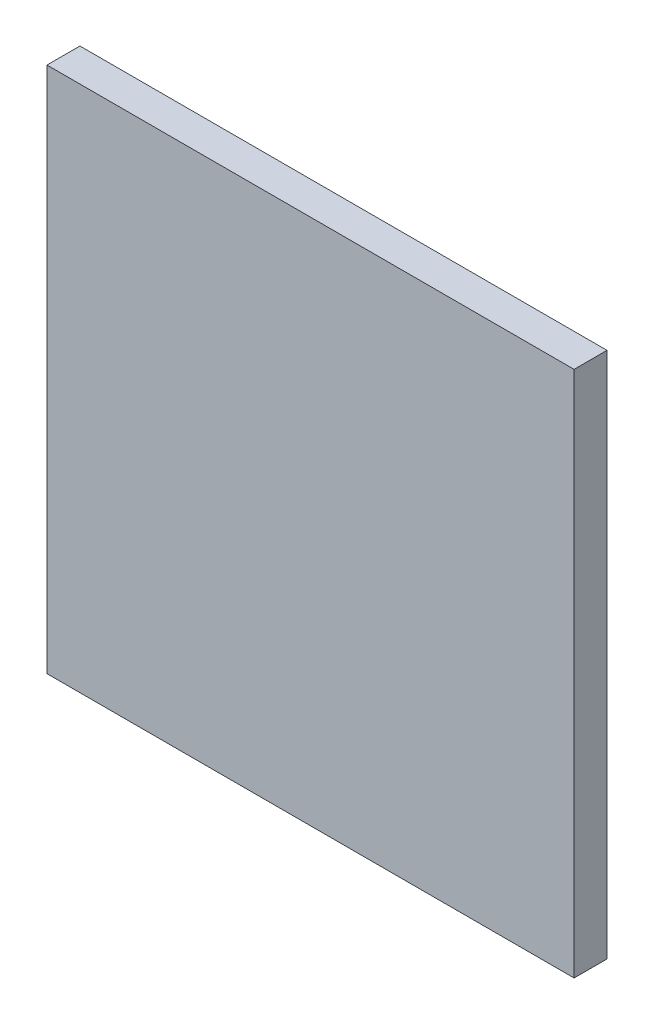
ISO-10303-21;
HEADER;
FILE_DESCRIPTION(('STEP AP214'),'2;1');
FILE_NAME('part.step','',(''),(''),'','','');
FILE_SCHEMA(('AUTOMOTIVE_DESIGN { 1 0 10303 214 1 1 1 1 }'));
ENDSEC;
DATA;
#1=APPLICATION_CONTEXT('core data for automotive mechanical design processes');
#2=APPLICATION_PROTOCOL_DEFINITION('international standard','automotive_design',2000,#1);
#3=PRODUCT_CONTEXT('',#1,'mechanical');
#4=PRODUCT('Part','Part','',(#3));
#5=PRODUCT_RELATED_PRODUCT_CATEGORY('part','',(#4));
#6=PRODUCT_DEFINITION_FORMATION('','',#4);
#7=PRODUCT_DEFINITION_CONTEXT('part definition',#1,'design');
#8=PRODUCT_DEFINITION('design','',#6,#7);
#9=PRODUCT_DEFINITION_SHAPE('','',#8);
#10=(LENGTH_UNIT() NAMED_UNIT(*) SI_UNIT(.MILLI.,.METRE.));
#11=(NAMED_UNIT(*) PLANE_ANGLE_UNIT() SI_UNIT($,.RADIAN.));
#12=(NAMED_UNIT(*) SI_UNIT($,.STERADIAN.) SOLID_ANGLE_UNIT());
#13=UNCERTAINTY_MEASURE_WITH_UNIT(LENGTH_MEASURE(1.E-05),#10,'distance_accuracy_value','');
#14=(GEOMETRIC_REPRESENTATION_CONTEXT(3) GLOBAL_UNCERTAINTY_ASSIGNED_CONTEXT((#13)) GLOBAL_UNIT_ASSIGNED_CONTEXT((#10,
#11,#12)) REPRESENTATION_CONTEXT('',''));
#15=CARTESIAN_POINT('',(0.,0.,0.));
#16=DIRECTION('',(0.,0.,1.));
#17=DIRECTION('',(1.,0.,0.));
#18=AXIS2_PLACEMENT_3D('',#15,#16,#17);
#19=CARTESIAN_POINT('',(152.4,-152.4,19.05));
#20=DIRECTION('',(-1.,0.,0.));
#21=DIRECTION('',(0.,0.,1.));
#22=AXIS2_PLACEMENT_3D('',#19,#20,#21);
#23=PLANE('',#22);
#24=DIRECTION('',(0.,1.,0.));
#25=VECTOR('',#24,1.);
#26=CARTESIAN_POINT('',(152.4,-152.4,0.));
#27=LINE('',#26,#25);
#28=CARTESIAN_POINT('',(152.4,-152.4,0.));
#29=VERTEX_POINT('',#28);
#30=CARTESIAN_POINT('',(152.4,152.4,0.));
#31=VERTEX_POINT('',#30);
#32=EDGE_CURVE('E176',#29,#31,#27,.T.);
#33=ORIENTED_EDGE('',*,*,#32,.T.);
#34=DIRECTION('',(0.,0.,-1.));
#35=VECTOR('',#34,1.);
#36=CARTESIAN_POINT('',(152.4,152.4,19.05));
#37=LINE('',#36,#35);
#38=CARTESIAN_POINT('',(152.4,152.4,19.05));
#39=VERTEX_POINT('',#38);
#40=EDGE_CURVE('E46',#39,#31,#37,.T.);
#41=ORIENTED_EDGE('',*,*,#40,.F.);
#42=DIRECTION('',(0.,1.,0.));
#43=VECTOR('',#42,1.);
#44=CARTESIAN_POINT('',(152.4,-152.4,19.05));
#45=LINE('',#44,#43);
#46=CARTESIAN_POINT('',(152.4,-152.4,19.05));
#47=VERTEX_POINT('',#46);
#48=EDGE_CURVE('E182',#47,#39,#45,.T.);
#49=ORIENTED_EDGE('',*,*,#48,.F.);
#50=DIRECTION('',(0.,0.,-1.));
#51=VECTOR('',#50,1.);
#52=CARTESIAN_POINT('',(152.4,-152.4,19.05));
#53=LINE('',#52,#51);
#54=EDGE_CURVE('E192',#47,#29,#53,.T.);
#55=ORIENTED_EDGE('',*,*,#54,.T.);
#56=EDGE_LOOP('',(#33,#41,#49,#55));
#57=FACE_BOUND('',#56,.T.);
#58=ADVANCED_FACE('F39',(#57),#23,.F.);
#59=CARTESIAN_POINT('',(-152.4,152.4,19.05));
#60=DIRECTION('',(0.,-1.,0.));
#61=DIRECTION('',(0.,0.,-1.));
#62=AXIS2_PLACEMENT_3D('',#59,#60,#61);
#63=PLANE('',#62);
#64=DIRECTION('',(-1.,0.,0.));
#65=VECTOR('',#64,1.);
#66=CARTESIAN_POINT('',(-152.4,152.4,0.));
#67=LINE('',#66,#65);
#68=CARTESIAN_POINT('',(-152.4,152.4,0.));
#69=VERTEX_POINT('',#68);
#70=EDGE_CURVE('E195',#31,#69,#67,.T.);
#71=ORIENTED_EDGE('',*,*,#70,.T.);
#72=DIRECTION('',(0.,0.,-1.));
#73=VECTOR('',#72,1.);
#74=CARTESIAN_POINT('',(-152.4,152.4,19.05));
#75=LINE('',#74,#73);
#76=CARTESIAN_POINT('',(-152.4,152.4,19.05));
#77=VERTEX_POINT('',#76);
#78=EDGE_CURVE('E205',#77,#69,#75,.T.);
#79=ORIENTED_EDGE('',*,*,#78,.F.);
#80=DIRECTION('',(-1.,0.,0.));
#81=VECTOR('',#80,1.);
#82=CARTESIAN_POINT('',(-152.4,152.4,19.05));
#83=LINE('',#82,#81);
#84=EDGE_CURVE('E185',#39,#77,#83,.T.);
#85=ORIENTED_EDGE('',*,*,#84,.F.);
#86=ORIENTED_EDGE('',*,*,#40,.T.);
#87=EDGE_LOOP('',(#71,#79,#85,#86));
#88=FACE_BOUND('',#87,.T.);
#89=ADVANCED_FACE('F210',(#88),#63,.F.);
#90=CARTESIAN_POINT('',(-152.4,-152.4,19.05));
#91=DIRECTION('',(1.,0.,0.));
#92=DIRECTION('',(0.,0.,-1.));
#93=AXIS2_PLACEMENT_3D('',#90,#91,#92);
#94=PLANE('',#93);
#95=DIRECTION('',(0.,-1.,0.));
#96=VECTOR('',#95,1.);
#97=CARTESIAN_POINT('',(-152.4,-152.4,0.));
#98=LINE('',#97,#96);
#99=CARTESIAN_POINT('',(-152.4,-152.4,0.));
#100=VERTEX_POINT('',#99);
#101=EDGE_CURVE('E197',#69,#100,#98,.T.);
#102=ORIENTED_EDGE('',*,*,#101,.T.);
#103=DIRECTION('',(0.,0.,-1.));
#104=VECTOR('',#103,1.);
#105=CARTESIAN_POINT('',(-152.4,-152.4,19.05));
#106=LINE('',#105,#104);
#107=CARTESIAN_POINT('',(-152.4,-152.4,19.05));
#108=VERTEX_POINT('',#107);
#109=EDGE_CURVE('E202',#108,#100,#106,.T.);
#110=ORIENTED_EDGE('',*,*,#109,.F.);
#111=DIRECTION('',(0.,-1.,0.));
#112=VECTOR('',#111,1.);
#113=CARTESIAN_POINT('',(-152.4,-152.4,19.05));
#114=LINE('',#113,#112);
#115=EDGE_CURVE('E188',#77,#108,#114,.T.);
#116=ORIENTED_EDGE('',*,*,#115,.F.);
#117=ORIENTED_EDGE('',*,*,#78,.T.);
#118=EDGE_LOOP('',(#102,#110,#116,#117));
#119=FACE_BOUND('',#118,.T.);
#120=ADVANCED_FACE('F222',(#119),#94,.F.);
#121=CARTESIAN_POINT('',(-152.4,-152.4,19.05));
#122=DIRECTION('',(0.,1.,0.));
#123=DIRECTION('',(0.,0.,1.));
#124=AXIS2_PLACEMENT_3D('',#121,#122,#123);
#125=PLANE('',#124);
#126=DIRECTION('',(1.,0.,0.));
#127=VECTOR('',#126,1.);
#128=CARTESIAN_POINT('',(-152.4,-152.4,0.));
#129=LINE('',#128,#127);
#130=EDGE_CURVE('E186',#100,#29,#129,.T.);
#131=ORIENTED_EDGE('',*,*,#130,.T.);
#132=ORIENTED_EDGE('',*,*,#54,.F.);
#133=DIRECTION('',(1.,0.,0.));
#134=VECTOR('',#133,1.);
#135=CARTESIAN_POINT('',(-152.4,-152.4,19.05));
#136=LINE('',#135,#134);
#137=EDGE_CURVE('E190',#108,#47,#136,.T.);
#138=ORIENTED_EDGE('',*,*,#137,.F.);
#139=ORIENTED_EDGE('',*,*,#109,.T.);
#140=EDGE_LOOP('',(#131,#132,#138,#139));
#141=FACE_BOUND('',#140,.T.);
#142=ADVANCED_FACE('F226',(#141),#125,.F.);
#143=CARTESIAN_POINT('',(0.,0.,19.05));
#144=DIRECTION('',(0.,0.,-1.));
#145=DIRECTION('',(-1.,0.,0.));
#146=AXIS2_PLACEMENT_3D('',#143,#144,#145);
#147=PLANE('',#146);
#148=ORIENTED_EDGE('',*,*,#48,.T.);
#149=ORIENTED_EDGE('',*,*,#84,.T.);
#150=ORIENTED_EDGE('',*,*,#115,.T.);
#151=ORIENTED_EDGE('',*,*,#137,.T.);
#152=EDGE_LOOP('',(#148,#149,#150,#151));
#153=FACE_BOUND('',#152,.T.);
#154=ADVANCED_FACE('F228',(#153),#147,.F.);
#155=CARTESIAN_POINT('',(0.,0.,0.));
#156=DIRECTION('',(0.,0.,-1.));
#157=DIRECTION('',(-1.,0.,0.));
#158=AXIS2_PLACEMENT_3D('',#155,#156,#157);
#159=PLANE('',#158);
#160=DIRECTION('',(0.,1.,0.));
#161=VECTOR('',#160,1.);
#162=CARTESIAN_POINT('',(-127.,127.,0.));
#163=LINE('',#162,#161);
#164=CARTESIAN_POINT('',(-127.,-127.,0.));
#165=VERTEX_POINT('',#164);
#166=CARTESIAN_POINT('',(-127.,127.,0.));
#167=VERTEX_POINT('',#166);
#168=EDGE_CURVE('E164',#165,#167,#163,.T.);
#169=ORIENTED_EDGE('',*,*,#168,.F.);
#170=DIRECTION('',(-1.,0.,0.));
#171=VECTOR('',#170,1.);
#172=CARTESIAN_POINT('',(127.,-127.,0.));
#173=LINE('',#172,#171);
#174=CARTESIAN_POINT('',(127.,-127.,0.));
#175=VERTEX_POINT('',#174);
#176=EDGE_CURVE('E171',#175,#165,#173,.T.);
#177=ORIENTED_EDGE('',*,*,#176,.F.);
#178=DIRECTION('',(0.,-1.,0.));
#179=VECTOR('',#178,1.);
#180=CARTESIAN_POINT('',(127.,127.,0.));
#181=LINE('',#180,#179);
#182=CARTESIAN_POINT('',(127.,127.,0.));
#183=VERTEX_POINT('',#182);
#184=EDGE_CURVE('E168',#183,#175,#181,.T.);
#185=ORIENTED_EDGE('',*,*,#184,.F.);
#186=DIRECTION('',(1.,0.,0.));
#187=VECTOR('',#186,1.);
#188=CARTESIAN_POINT('',(127.,127.,0.));
#189=LINE('',#188,#187);
#190=EDGE_CURVE('E166',#167,#183,#189,.T.);
#191=ORIENTED_EDGE('',*,*,#190,.F.);
#192=EDGE_LOOP('',(#169,#177,#185,#191));
#193=FACE_BOUND('',#192,.T.);
#194=ORIENTED_EDGE('',*,*,#32,.F.);
#195=ORIENTED_EDGE('',*,*,#130,.F.);
#196=ORIENTED_EDGE('',*,*,#101,.F.);
#197=ORIENTED_EDGE('',*,*,#70,.F.);
#198=EDGE_LOOP('',(#194,#195,#196,#197));
#199=FACE_BOUND('',#198,.T.);
#200=ADVANCED_FACE('F218',(#193,#199),#159,.T.);
#201=CARTESIAN_POINT('',(-127.,127.,18.796));
#202=DIRECTION('',(-1.,0.,0.));
#203=DIRECTION('',(0.,0.,1.));
#204=AXIS2_PLACEMENT_3D('',#201,#202,#203);
#205=PLANE('',#204);
#206=DIRECTION('',(0.,0.,-1.));
#207=VECTOR('',#206,1.);
#208=CARTESIAN_POINT('',(-127.,127.,18.796));
#209=LINE('',#208,#207);
#210=CARTESIAN_POINT('',(-127.,127.,7.112));
#211=VERTEX_POINT('',#210);
#212=EDGE_CURVE('E59',#211,#167,#209,.T.);
#213=ORIENTED_EDGE('',*,*,#212,.F.);
#214=DIRECTION('',(0.,-1.,0.));
#215=VECTOR('',#214,1.);
#216=CARTESIAN_POINT('',(-127.,127.,7.112));
#217=LINE('',#216,#215);
#218=CARTESIAN_POINT('',(-127.,-127.,7.112));
#219=VERTEX_POINT('',#218);
#220=EDGE_CURVE('E53',#211,#219,#217,.T.);
#221=ORIENTED_EDGE('',*,*,#220,.T.);
#222=DIRECTION('',(0.,0.,-1.));
#223=VECTOR('',#222,1.);
#224=CARTESIAN_POINT('',(-127.,-127.,18.796));
#225=LINE('',#224,#223);
#226=EDGE_CURVE('E174',#219,#165,#225,.T.);
#227=ORIENTED_EDGE('',*,*,#226,.T.);
#228=ORIENTED_EDGE('',*,*,#168,.T.);
#229=EDGE_LOOP('',(#213,#221,#227,#228));
#230=FACE_BOUND('',#229,.T.);
#231=ADVANCED_FACE('F235',(#230),#205,.F.);
#232=CARTESIAN_POINT('',(127.,-127.,18.796));
#233=DIRECTION('',(0.,-1.,0.));
#234=DIRECTION('',(0.,0.,-1.));
#235=AXIS2_PLACEMENT_3D('',#232,#233,#234);
#236=PLANE('',#235);
#237=ORIENTED_EDGE('',*,*,#226,.F.);
#238=DIRECTION('',(1.,0.,0.));
#239=VECTOR('',#238,1.);
#240=CARTESIAN_POINT('',(127.,-127.,7.112));
#241=LINE('',#240,#239);
#242=CARTESIAN_POINT('',(127.,-127.,7.112));
#243=VERTEX_POINT('',#242);
#244=EDGE_CURVE('E155',#219,#243,#241,.T.);
#245=ORIENTED_EDGE('',*,*,#244,.T.);
#246=DIRECTION('',(0.,0.,-1.));
#247=VECTOR('',#246,1.);
#248=CARTESIAN_POINT('',(127.,-127.,18.796));
#249=LINE('',#248,#247);
#250=EDGE_CURVE('E177',#243,#175,#249,.T.);
#251=ORIENTED_EDGE('',*,*,#250,.T.);
#252=ORIENTED_EDGE('',*,*,#176,.T.);
#253=EDGE_LOOP('',(#237,#245,#251,#252));
#254=FACE_BOUND('',#253,.T.);
#255=ADVANCED_FACE('F275',(#254),#236,.F.);
#256=CARTESIAN_POINT('',(127.,127.,18.796));
#257=DIRECTION('',(1.,0.,0.));
#258=DIRECTION('',(0.,0.,-1.));
#259=AXIS2_PLACEMENT_3D('',#256,#257,#258);
#260=PLANE('',#259);
#261=ORIENTED_EDGE('',*,*,#250,.F.);
#262=DIRECTION('',(0.,1.,0.));
#263=VECTOR('',#262,1.);
#264=CARTESIAN_POINT('',(127.,127.,7.112));
#265=LINE('',#264,#263);
#266=CARTESIAN_POINT('',(127.,127.,7.112));
#267=VERTEX_POINT('',#266);
#268=EDGE_CURVE('E151',#243,#267,#265,.T.);
#269=ORIENTED_EDGE('',*,*,#268,.T.);
#270=DIRECTION('',(0.,0.,-1.));
#271=VECTOR('',#270,1.);
#272=CARTESIAN_POINT('',(127.,127.,18.796));
#273=LINE('',#272,#271);
#274=EDGE_CURVE('E179',#267,#183,#273,.T.);
#275=ORIENTED_EDGE('',*,*,#274,.T.);
#276=ORIENTED_EDGE('',*,*,#184,.T.);
#277=EDGE_LOOP('',(#261,#269,#275,#276));
#278=FACE_BOUND('',#277,.T.);
#279=ADVANCED_FACE('F284',(#278),#260,.F.);
#280=CARTESIAN_POINT('',(127.,127.,18.796));
#281=DIRECTION('',(0.,1.,0.));
#282=DIRECTION('',(0.,0.,1.));
#283=AXIS2_PLACEMENT_3D('',#280,#281,#282);
#284=PLANE('',#283);
#285=ORIENTED_EDGE('',*,*,#274,.F.);
#286=DIRECTION('',(-1.,0.,0.));
#287=VECTOR('',#286,1.);
#288=CARTESIAN_POINT('',(127.,127.,7.112));
#289=LINE('',#288,#287);
#290=EDGE_CURVE('E11',#267,#211,#289,.T.);
#291=ORIENTED_EDGE('',*,*,#290,.T.);
#292=ORIENTED_EDGE('',*,*,#212,.T.);
#293=ORIENTED_EDGE('',*,*,#190,.T.);
#294=EDGE_LOOP('',(#285,#291,#292,#293));
#295=FACE_BOUND('',#294,.T.);
#296=ADVANCED_FACE('F294',(#295),#284,.F.);
#297=CARTESIAN_POINT('',(0.,0.,7.112));
#298=DIRECTION('',(0.,0.,-1.));
#299=DIRECTION('',(-1.,0.,0.));
#300=AXIS2_PLACEMENT_3D('',#297,#298,#299);
#301=PLANE('',#300);
#302=DIRECTION('',(0.,1.,0.));
#303=VECTOR('',#302,1.);
#304=CARTESIAN_POINT('',(-139.7,139.7,7.112));
#305=LINE('',#304,#303);
#306=CARTESIAN_POINT('',(-139.7,-139.7,7.112));
#307=VERTEX_POINT('',#306);
#308=CARTESIAN_POINT('',(-139.7,139.7,7.112));
#309=VERTEX_POINT('',#308);
#310=EDGE_CURVE('E131',#307,#309,#305,.T.);
#311=ORIENTED_EDGE('',*,*,#310,.F.);
#312=DIRECTION('',(-1.,0.,0.));
#313=VECTOR('',#312,1.);
#314=CARTESIAN_POINT('',(139.7,-139.7,7.112));
#315=LINE('',#314,#313);
#316=CARTESIAN_POINT('',(139.7,-139.7,7.112));
#317=VERTEX_POINT('',#316);
#318=EDGE_CURVE('E371',#317,#307,#315,.T.);
#319=ORIENTED_EDGE('',*,*,#318,.F.);
#320=DIRECTION('',(0.,-1.,0.));
#321=VECTOR('',#320,1.);
#322=CARTESIAN_POINT('',(139.7,139.7,7.112));
#323=LINE('',#322,#321);
#324=CARTESIAN_POINT('',(139.7,139.7,7.112));
#325=VERTEX_POINT('',#324);
#326=EDGE_CURVE('E132',#325,#317,#323,.T.);
#327=ORIENTED_EDGE('',*,*,#326,.F.);
#328=DIRECTION('',(1.,0.,0.));
#329=VECTOR('',#328,1.);
#330=CARTESIAN_POINT('',(139.7,139.7,7.112));
#331=LINE('',#330,#329);
#332=EDGE_CURVE('E127',#309,#325,#331,.T.);
#333=ORIENTED_EDGE('',*,*,#332,.F.);
#334=EDGE_LOOP('',(#311,#319,#327,#333));
#335=FACE_BOUND('',#334,.T.);
#336=ORIENTED_EDGE('',*,*,#290,.F.);
#337=ORIENTED_EDGE('',*,*,#268,.F.);
#338=ORIENTED_EDGE('',*,*,#244,.F.);
#339=ORIENTED_EDGE('',*,*,#220,.F.);
#340=EDGE_LOOP('',(#336,#337,#338,#339));
#341=FACE_BOUND('',#340,.T.);
#342=ADVANCED_FACE('F129',(#335,#341),#301,.F.);
#343=CARTESIAN_POINT('',(-139.7,139.7,7.112));
#344=DIRECTION('',(1.,0.,0.));
#345=DIRECTION('',(0.,0.,-1.));
#346=AXIS2_PLACEMENT_3D('',#343,#344,#345);
#347=PLANE('',#346);
#348=DIRECTION('',(0.,1.,0.));
#349=VECTOR('',#348,1.);
#350=CARTESIAN_POINT('',(-139.7,139.7,18.796));
#351=LINE('',#350,#349);
#352=CARTESIAN_POINT('',(-139.7,-139.7,18.796));
#353=VERTEX_POINT('',#352);
#354=CARTESIAN_POINT('',(-139.7,139.7,18.796));
#355=VERTEX_POINT('',#354);
#356=EDGE_CURVE('E376',#353,#355,#351,.T.);
#357=ORIENTED_EDGE('',*,*,#356,.F.);
#358=DIRECTION('',(0.,0.,1.));
#359=VECTOR('',#358,1.);
#360=CARTESIAN_POINT('',(-139.7,-139.7,7.112));
#361=LINE('',#360,#359);
#362=EDGE_CURVE('E146',#307,#353,#361,.T.);
#363=ORIENTED_EDGE('',*,*,#362,.F.);
#364=ORIENTED_EDGE('',*,*,#310,.T.);
#365=DIRECTION('',(0.,0.,1.));
#366=VECTOR('',#365,1.);
#367=CARTESIAN_POINT('',(-139.7,139.7,7.112));
#368=LINE('',#367,#366);
#369=EDGE_CURVE('E143',#309,#355,#368,.T.);
#370=ORIENTED_EDGE('',*,*,#369,.T.);
#371=EDGE_LOOP('',(#357,#363,#364,#370));
#372=FACE_BOUND('',#371,.T.);
#373=ADVANCED_FACE('F142',(#372),#347,.T.);
#374=CARTESIAN_POINT('',(139.7,139.7,7.112));
#375=DIRECTION('',(0.,-1.,0.));
#376=DIRECTION('',(0.,0.,-1.));
#377=AXIS2_PLACEMENT_3D('',#374,#375,#376);
#378=PLANE('',#377);
#379=DIRECTION('',(1.,0.,0.));
#380=VECTOR('',#379,1.);
#381=CARTESIAN_POINT('',(139.7,139.7,18.796));
#382=LINE('',#381,#380);
#383=CARTESIAN_POINT('',(139.7,139.7,18.796));
#384=VERTEX_POINT('',#383);
#385=EDGE_CURVE('E150',#355,#384,#382,.T.);
#386=ORIENTED_EDGE('',*,*,#385,.F.);
#387=ORIENTED_EDGE('',*,*,#369,.F.);
#388=ORIENTED_EDGE('',*,*,#332,.T.);
#389=DIRECTION('',(0.,0.,1.));
#390=VECTOR('',#389,1.);
#391=CARTESIAN_POINT('',(139.7,139.7,7.112));
#392=LINE('',#391,#390);
#393=EDGE_CURVE('E152',#325,#384,#392,.T.);
#394=ORIENTED_EDGE('',*,*,#393,.T.);
#395=EDGE_LOOP('',(#386,#387,#388,#394));
#396=FACE_BOUND('',#395,.T.);
#397=ADVANCED_FACE('F149',(#396),#378,.T.);
#398=CARTESIAN_POINT('',(139.7,139.7,7.112));
#399=DIRECTION('',(-1.,0.,0.));
#400=DIRECTION('',(0.,0.,1.));
#401=AXIS2_PLACEMENT_3D('',#398,#399,#400);
#402=PLANE('',#401);
#403=DIRECTION('',(0.,-1.,0.));
#404=VECTOR('',#403,1.);
#405=CARTESIAN_POINT('',(139.7,139.7,18.796));
#406=LINE('',#405,#404);
#407=CARTESIAN_POINT('',(139.7,-139.7,18.796));
#408=VERTEX_POINT('',#407);
#409=EDGE_CURVE('E366',#384,#408,#406,.T.);
#410=ORIENTED_EDGE('',*,*,#409,.F.);
#411=ORIENTED_EDGE('',*,*,#393,.F.);
#412=ORIENTED_EDGE('',*,*,#326,.T.);
#413=DIRECTION('',(0.,0.,1.));
#414=VECTOR('',#413,1.);
#415=CARTESIAN_POINT('',(139.7,-139.7,7.112));
#416=LINE('',#415,#414);
#417=EDGE_CURVE('E157',#317,#408,#416,.T.);
#418=ORIENTED_EDGE('',*,*,#417,.T.);
#419=EDGE_LOOP('',(#410,#411,#412,#418));
#420=FACE_BOUND('',#419,.T.);
#421=ADVANCED_FACE('F342',(#420),#402,.T.);
#422=CARTESIAN_POINT('',(139.7,-139.7,7.112));
#423=DIRECTION('',(0.,1.,0.));
#424=DIRECTION('',(0.,0.,1.));
#425=AXIS2_PLACEMENT_3D('',#422,#423,#424);
#426=PLANE('',#425);
#427=DIRECTION('',(-1.,0.,0.));
#428=VECTOR('',#427,1.);
#429=CARTESIAN_POINT('',(139.7,-139.7,18.796));
#430=LINE('',#429,#428);
#431=EDGE_CURVE('E147',#408,#353,#430,.T.);
#432=ORIENTED_EDGE('',*,*,#431,.F.);
#433=ORIENTED_EDGE('',*,*,#417,.F.);
#434=ORIENTED_EDGE('',*,*,#318,.T.);
#435=ORIENTED_EDGE('',*,*,#362,.T.);
#436=EDGE_LOOP('',(#432,#433,#434,#435));
#437=FACE_BOUND('',#436,.T.);
#438=ADVANCED_FACE('F315',(#437),#426,.T.);
#439=CARTESIAN_POINT('',(0.,0.,18.796));
#440=DIRECTION('',(0.,0.,-1.));
#441=DIRECTION('',(-1.,0.,0.));
#442=AXIS2_PLACEMENT_3D('',#439,#440,#441);
#443=PLANE('',#442);
#444=ORIENTED_EDGE('',*,*,#356,.T.);
#445=ORIENTED_EDGE('',*,*,#385,.T.);
#446=ORIENTED_EDGE('',*,*,#409,.T.);
#447=ORIENTED_EDGE('',*,*,#431,.T.);
#448=EDGE_LOOP('',(#444,#445,#446,#447));
#449=FACE_BOUND('',#448,.T.);
#450=ADVANCED_FACE('F309',(#449),#443,.T.);
#451=CLOSED_SHELL('',(#58,#89,#120,#142,#154,#200,#231,#255,#279,#296,#342,#373,#397,#421,#438,#450));
#452=MANIFOLD_SOLID_BREP('B2',#451);
#453=ADVANCED_BREP_SHAPE_REPRESENTATION('',(#18,#452),#14);
#454=SHAPE_DEFINITION_REPRESENTATION(#9,#453);
ENDSEC;
END-ISO-10303-21;
